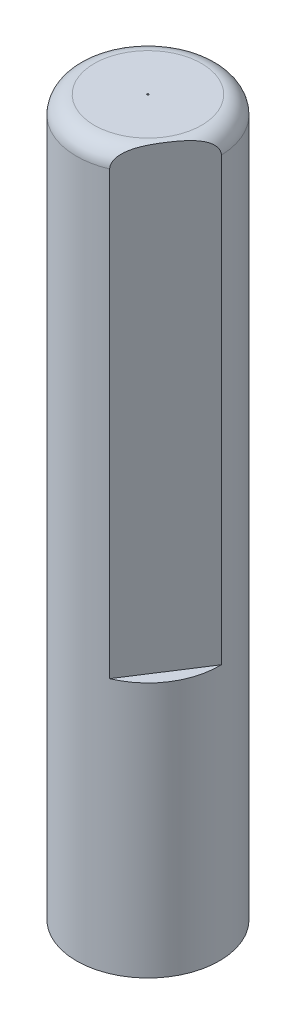
ISO-10303-21;
HEADER;
FILE_DESCRIPTION(('STEP AP214'),'2;1');
FILE_NAME('part.step','',(''),(''),'','','');
FILE_SCHEMA(('AUTOMOTIVE_DESIGN { 1 0 10303 214 1 1 1 1 }'));
ENDSEC;
DATA;
#1=APPLICATION_CONTEXT('core data for automotive mechanical design processes');
#2=APPLICATION_PROTOCOL_DEFINITION('international standard','automotive_design',2000,#1);
#3=PRODUCT_CONTEXT('',#1,'mechanical');
#4=PRODUCT('Part','Part','',(#3));
#5=PRODUCT_RELATED_PRODUCT_CATEGORY('part','',(#4));
#6=PRODUCT_DEFINITION_FORMATION('','',#4);
#7=PRODUCT_DEFINITION_CONTEXT('part definition',#1,'design');
#8=PRODUCT_DEFINITION('design','',#6,#7);
#9=PRODUCT_DEFINITION_SHAPE('','',#8);
#10=(LENGTH_UNIT() NAMED_UNIT(*) SI_UNIT(.MILLI.,.METRE.));
#11=(NAMED_UNIT(*) PLANE_ANGLE_UNIT() SI_UNIT($,.RADIAN.));
#12=(NAMED_UNIT(*) SI_UNIT($,.STERADIAN.) SOLID_ANGLE_UNIT());
#13=UNCERTAINTY_MEASURE_WITH_UNIT(LENGTH_MEASURE(1.E-05),#10,'distance_accuracy_value','');
#14=(GEOMETRIC_REPRESENTATION_CONTEXT(3) GLOBAL_UNCERTAINTY_ASSIGNED_CONTEXT((#13)) GLOBAL_UNIT_ASSIGNED_CONTEXT((#10,
#11,#12)) REPRESENTATION_CONTEXT('',''));
#15=CARTESIAN_POINT('',(0.,0.,0.));
#16=DIRECTION('',(0.,0.,1.));
#17=DIRECTION('',(1.,0.,0.));
#18=AXIS2_PLACEMENT_3D('',#15,#16,#17);
#19=CARTESIAN_POINT('',(0.,40.,0.));
#20=DIRECTION('',(0.,-1.,0.));
#21=DIRECTION('',(0.,0.,-1.));
#22=AXIS2_PLACEMENT_3D('',#19,#20,#21);
#23=CYLINDRICAL_SURFACE('',#22,4.);
#24=CARTESIAN_POINT('',(0.,39.,0.));
#25=DIRECTION('',(0.,1.,0.));
#26=DIRECTION('',(0.,0.,1.));
#27=AXIS2_PLACEMENT_3D('',#24,#25,#26);
#28=CIRCLE('',#27,4.);
#29=CARTESIAN_POINT('',(1.54618885179598,39.,3.68907848040426));
#30=VERTEX_POINT('',#29);
#31=CARTESIAN_POINT('',(3.99851204729971,39.,-0.109093572675266));
#32=VERTEX_POINT('',#31);
#33=EDGE_CURVE('E46',#30,#32,#28,.F.);
#34=ORIENTED_EDGE('',*,*,#33,.T.);
#35=DIRECTION('',(0.,1.,0.));
#36=VECTOR('',#35,1.);
#37=CARTESIAN_POINT('',(3.99851204729971,14.3,-0.109093572675266));
#38=LINE('',#37,#36);
#39=CARTESIAN_POINT('',(3.99851204729971,14.3,-0.109093572675266));
#40=VERTEX_POINT('',#39);
#41=EDGE_CURVE('E52',#40,#32,#38,.T.);
#42=ORIENTED_EDGE('',*,*,#41,.F.);
#43=CARTESIAN_POINT('',(0.,14.3,0.));
#44=DIRECTION('',(0.,1.,0.));
#45=DIRECTION('',(0.,0.,1.));
#46=AXIS2_PLACEMENT_3D('',#43,#44,#45);
#47=CIRCLE('',#46,4.);
#48=CARTESIAN_POINT('',(1.54618885179598,14.3,3.68907848040426));
#49=VERTEX_POINT('',#48);
#50=EDGE_CURVE('E64',#49,#40,#47,.T.);
#51=ORIENTED_EDGE('',*,*,#50,.F.);
#52=DIRECTION('',(0.,1.,0.));
#53=VECTOR('',#52,1.);
#54=CARTESIAN_POINT('',(1.54618885179598,14.3,3.68907848040426));
#55=LINE('',#54,#53);
#56=EDGE_CURVE('E71',#49,#30,#55,.T.);
#57=ORIENTED_EDGE('',*,*,#56,.T.);
#58=EDGE_LOOP('',(#34,#42,#51,#57));
#59=FACE_BOUND('',#58,.T.);
#60=CARTESIAN_POINT('',(0.,0.,0.));
#61=DIRECTION('',(0.,1.,0.));
#62=DIRECTION('',(0.,0.,1.));
#63=AXIS2_PLACEMENT_3D('',#60,#61,#62);
#64=CIRCLE('',#63,4.);
#65=CARTESIAN_POINT('',(0.,0.,4.));
#66=VERTEX_POINT('',#65);
#67=EDGE_CURVE('E77',#66,#66,#64,.T.);
#68=ORIENTED_EDGE('',*,*,#67,.T.);
#69=EDGE_LOOP('',(#68));
#70=FACE_BOUND('',#69,.T.);
#71=ADVANCED_FACE('F33',(#59,#70),#23,.T.);
#72=CARTESIAN_POINT('',(0.,40.,0.));
#73=DIRECTION('',(0.,1.,0.));
#74=DIRECTION('',(0.,0.,1.));
#75=AXIS2_PLACEMENT_3D('',#72,#73,#74);
#76=PLANE('',#75);
#77=CARTESIAN_POINT('',(0.,40.,0.));
#78=DIRECTION('',(0.,1.,0.));
#79=DIRECTION('',(0.,0.,1.));
#80=AXIS2_PLACEMENT_3D('',#77,#78,#79);
#81=CIRCLE('',#80,0.05);
#82=CARTESIAN_POINT('',(0.,40.,0.05));
#83=VERTEX_POINT('',#82);
#84=EDGE_CURVE('E118',#83,#83,#81,.T.);
#85=ORIENTED_EDGE('',*,*,#84,.F.);
#86=EDGE_LOOP('',(#85));
#87=FACE_BOUND('',#86,.T.);
#88=CARTESIAN_POINT('',(0.,40.,0.));
#89=DIRECTION('',(0.,1.,0.));
#90=DIRECTION('',(0.,0.,1.));
#91=AXIS2_PLACEMENT_3D('',#88,#89,#90);
#92=CIRCLE('',#91,3.);
#93=CARTESIAN_POINT('',(0.,40.,3.));
#94=VERTEX_POINT('',#93);
#95=EDGE_CURVE('E82',#94,#94,#92,.T.);
#96=ORIENTED_EDGE('',*,*,#95,.T.);
#97=EDGE_LOOP('',(#96));
#98=FACE_BOUND('',#97,.T.);
#99=ADVANCED_FACE('F86',(#87,#98),#76,.T.);
#100=CARTESIAN_POINT('',(0.,0.,0.));
#101=DIRECTION('',(0.,1.,0.));
#102=DIRECTION('',(0.,0.,1.));
#103=AXIS2_PLACEMENT_3D('',#100,#101,#102);
#104=PLANE('',#103);
#105=ORIENTED_EDGE('',*,*,#67,.F.);
#106=EDGE_LOOP('',(#105));
#107=FACE_BOUND('',#106,.T.);
#108=ADVANCED_FACE('F89',(#107),#104,.F.);
#109=CARTESIAN_POINT('',(0.,39.,0.));
#110=DIRECTION('',(0.,1.,0.));
#111=DIRECTION('',(0.,0.,1.));
#112=AXIS2_PLACEMENT_3D('',#109,#110,#111);
#113=TOROIDAL_SURFACE('',#112,3.,1.);
#114=CARTESIAN_POINT('',(3.99851202810345,38.9998,-0.109093542943977));
#115=CARTESIAN_POINT('',(3.99851824517361,39.0189950744715,-0.109103171977453));
#116=CARTESIAN_POINT('',(3.99798841695442,39.0381768500488,-0.108282571031078));
#117=CARTESIAN_POINT('',(3.99588573081514,39.0763256928036,-0.105025918830723));
#118=CARTESIAN_POINT('',(3.99431394904272,39.0952929609931,-0.102591534320352));
#119=CARTESIAN_POINT('',(3.98812749551361,39.151199113523,-0.0930099200596374));
#120=CARTESIAN_POINT('',(3.98204020341005,39.1876115277384,-0.0835818875763722));
#121=CARTESIAN_POINT('',(3.96647755197017,39.2576525985254,-0.0594783648926014));
#122=CARTESIAN_POINT('',(3.95701458842517,39.2912908927355,-0.0448220733638847));
#123=CARTESIAN_POINT('',(3.93532294282226,39.3554744810642,-0.0112259298109686));
#124=CARTESIAN_POINT('',(3.92308596540246,39.3860100919903,0.00772677011670177));
#125=CARTESIAN_POINT('',(3.89053953228075,39.4565909108332,0.0581348700510551));
#126=CARTESIAN_POINT('',(3.86906452066948,39.4947993961929,0.0913954896508889));
#127=CARTESIAN_POINT('',(3.82316362758298,39.5645260277001,0.16248705280708));
#128=CARTESIAN_POINT('',(3.79873354887953,39.5960344781688,0.200324497054268));
#129=CARTESIAN_POINT('',(3.75220814044664,39.6483760346623,0.272383313115669));
#130=CARTESIAN_POINT('',(3.7304054311356,39.6701132137222,0.306151472768706));
#131=CARTESIAN_POINT('',(3.68585054508425,39.7100268542703,0.375158332606205));
#132=CARTESIAN_POINT('',(3.66309766198652,39.7282006074288,0.410398126801047));
#133=CARTESIAN_POINT('',(3.61687454725704,39.7615000699751,0.481988748662682));
#134=CARTESIAN_POINT('',(3.59340236367546,39.7766164462198,0.518342599520414));
#135=CARTESIAN_POINT('',(3.54601671667992,39.804166558947,0.591733757939312));
#136=CARTESIAN_POINT('',(3.52210345055714,39.8166014646796,0.628770759934778));
#137=CARTESIAN_POINT('',(3.4601192765708,39.8456908357651,0.724772199630726));
#138=CARTESIAN_POINT('',(3.42181642294887,39.8606584632945,0.784095876235326));
#139=CARTESIAN_POINT('',(3.34477672047379,39.8862333715987,0.903415403716402));
#140=CARTESIAN_POINT('',(3.30603959312196,39.8968376678736,0.963411685933223));
#141=CARTESIAN_POINT('',(3.22824194489927,39.9147178032767,1.08390512408057));
#142=CARTESIAN_POINT('',(3.1891808386309,39.9219847350082,1.14440318667807));
#143=CARTESIAN_POINT('',(3.11095700013189,39.9339421960324,1.26555671073896));
#144=CARTESIAN_POINT('',(3.07179429432871,39.9386333386944,1.32621213127136));
#145=CARTESIAN_POINT('',(2.99330109638701,39.9460285492576,1.44778284076251));
#146=CARTESIAN_POINT('',(2.9539704485416,39.9487267646091,1.50869837088099));
#147=CARTESIAN_POINT('',(2.87528456554741,39.9524800924675,1.63056751207265));
#148=CARTESIAN_POINT('',(2.83592932894269,39.9535350961358,1.69152112540079));
#149=CARTESIAN_POINT('',(2.7572727298212,39.9541527270616,1.81334491156458));
#150=CARTESIAN_POINT('',(2.71797137203506,39.9537175186063,1.87421507707338));
#151=CARTESIAN_POINT('',(2.63938502755026,39.9512972390789,1.99593005245799));
#152=CARTESIAN_POINT('',(2.60010003981029,39.9493122894254,2.05677486394659));
#153=CARTESIAN_POINT('',(2.5322630147351,39.9443030555334,2.16184123255454));
#154=CARTESIAN_POINT('',(2.50370195572398,39.9417090970132,2.20607676249663));
#155=CARTESIAN_POINT('',(2.44661490623173,39.9353679534134,2.29449350804297));
#156=CARTESIAN_POINT('',(2.41808892149857,39.9316205995091,2.33867471474472));
#157=CARTESIAN_POINT('',(2.33258246275743,39.9183136517893,2.47110760227924));
#158=CARTESIAN_POINT('',(2.275680725093,39.9066895981002,2.55923733581719));
#159=CARTESIAN_POINT('',(2.18629845619215,39.8818825742666,2.69767310007635));
#160=CARTESIAN_POINT('',(2.15359892221944,39.871405043988,2.74831832347579));
#161=CARTESIAN_POINT('',(2.08858469984483,39.8470043549461,2.84901271927512));
#162=CARTESIAN_POINT('',(2.05626985445817,39.8330826560031,2.89906213481391));
#163=CARTESIAN_POINT('',(1.99236286718969,39.8010203584254,2.99804163861043));
#164=CARTESIAN_POINT('',(1.96076871673026,39.7828936276516,3.04697483776453));
#165=CARTESIAN_POINT('',(1.8986165336737,39.741438403647,3.14323649085989));
#166=CARTESIAN_POINT('',(1.86805726479277,39.718116388894,3.19056685956453));
#167=CARTESIAN_POINT('',(1.81463637490991,39.6705364494529,3.27330543634581));
#168=CARTESIAN_POINT('',(1.7914744631834,39.6474362342943,3.3091787363973));
#169=CARTESIAN_POINT('',(1.74665463146518,39.5965795813335,3.37859594558408));
#170=CARTESIAN_POINT('',(1.72499783252854,39.5688197243455,3.41213811842292));
#171=CARTESIAN_POINT('',(1.68370980135965,39.5077907879947,3.47608525491777));
#172=CARTESIAN_POINT('',(1.66410058003659,39.4744702213778,3.50645612795296));
#173=CARTESIAN_POINT('',(1.62820545479316,39.4021816708344,3.56205070120959));
#174=CARTESIAN_POINT('',(1.61191304740526,39.363224999736,3.58728447403839));
#175=CARTESIAN_POINT('',(1.58796298252,39.291922427329,3.62437847016558));
#176=CARTESIAN_POINT('',(1.5791685974072,39.2608759252444,3.63799926363223));
#177=CARTESIAN_POINT('',(1.56446178170275,39.1965672900915,3.66077726308225));
#178=CARTESIAN_POINT('',(1.5585430376257,39.1633101947078,3.66994424742753));
#179=CARTESIAN_POINT('',(1.55160455952667,39.1081610032244,3.68069060160099));
#180=CARTESIAN_POINT('',(1.54957992444179,39.0866866449046,3.68382636788626));
#181=CARTESIAN_POINT('',(1.54686587130394,39.0434139755145,3.68802990875627));
#182=CARTESIAN_POINT('',(1.54617893041032,39.0216151386135,3.68909384670256));
#183=CARTESIAN_POINT('',(1.54618887099225,38.9998,3.68907845067297));
#184=B_SPLINE_CURVE_WITH_KNOTS('',3,(#114,#115,#116,#117,#118,#119,#120,#121,#122,#123,#124,
#125,#126,#127,#128,#129,#130,#131,#132,#133,#134,#135,#136,#137,#138,#139,#140,#141,#142,#143,
#144,#145,#146,#147,#148,#149,#150,#151,#152,#153,#154,#155,#156,#157,#158,#159,#160,#161,#162,
#163,#164,#165,#166,#167,#168,#169,#170,#171,#172,#173,#174,#175,#176,#177,#178,#179,#180,#181,
#182,#183),.UNSPECIFIED.,.F.,.F.,(4,2,2,2,2,2,2,2,2,2,2,2,2,2,2,2,2,2,2,2,2,2,2,2,2,2,2,2,2,2,2,
2,2,2,4),(0.,0.0575344747451716,0.115009619276603,0.228577497167076,0.341732564617331,
0.455230580215976,0.619374189281705,0.783753739382317,0.920648265927462,1.05764643725385,
1.1950567073338,1.33240693821998,1.54875798876412,1.76525677748926,1.98233008862061,
2.19935168592779,2.41700809515458,2.63467892029673,2.85203374863387,3.06937154943429,
3.22751429971477,3.38568020865258,3.70205206404476,3.8855418201803,4.06895393652833,
4.25176956389871,4.43435848522626,4.57976544694209,4.72527957664519,4.87222452076401,
5.01887850596692,5.12355597529953,5.22800257432773,5.29325991352605,5.35863798261898),.UNSPECIFIED.);
#185=EDGE_CURVE('E12',#32,#30,#184,.T.);
#186=ORIENTED_EDGE('',*,*,#185,.F.);
#187=ORIENTED_EDGE('',*,*,#33,.F.);
#188=EDGE_LOOP('',(#186,#187));
#189=FACE_BOUND('',#188,.T.);
#190=ORIENTED_EDGE('',*,*,#95,.F.);
#191=EDGE_LOOP('',(#190));
#192=FACE_BOUND('',#191,.T.);
#193=ADVANCED_FACE('F35',(#189,#192),#113,.T.);
#194=CARTESIAN_POINT('',(1.54618885179598,14.3,3.68907848040426));
#195=DIRECTION('',(-0.840106196832681,0.,-0.542421955716515));
#196=DIRECTION('',(-0.542421955716515,0.,0.840106196832681));
#197=AXIS2_PLACEMENT_3D('',#194,#195,#196);
#198=PLANE('',#197);
#199=ORIENTED_EDGE('',*,*,#185,.T.);
#200=ORIENTED_EDGE('',*,*,#56,.F.);
#201=DIRECTION('',(-0.542421955716514,0.,0.840106196832681));
#202=VECTOR('',#201,1.);
#203=CARTESIAN_POINT('',(1.54618885179598,14.3,3.68907848040426));
#204=LINE('',#203,#202);
#205=EDGE_CURVE('E66',#40,#49,#204,.T.);
#206=ORIENTED_EDGE('',*,*,#205,.F.);
#207=ORIENTED_EDGE('',*,*,#41,.T.);
#208=EDGE_LOOP('',(#199,#200,#206,#207));
#209=FACE_BOUND('',#208,.T.);
#210=ADVANCED_FACE('F70',(#209),#198,.F.);
#211=CARTESIAN_POINT('',(0.,14.3,0.));
#212=DIRECTION('',(0.,1.,0.));
#213=DIRECTION('',(0.,0.,1.));
#214=AXIS2_PLACEMENT_3D('',#211,#212,#213);
#215=PLANE('',#214);
#216=ORIENTED_EDGE('',*,*,#50,.T.);
#217=ORIENTED_EDGE('',*,*,#205,.T.);
#218=EDGE_LOOP('',(#216,#217));
#219=FACE_BOUND('',#218,.T.);
#220=ADVANCED_FACE('F65',(#219),#215,.T.);
#221=CARTESIAN_POINT('',(0.,39.9,0.));
#222=DIRECTION('',(0.,1.,0.));
#223=DIRECTION('',(0.,0.,1.));
#224=AXIS2_PLACEMENT_3D('',#221,#222,#223);
#225=CYLINDRICAL_SURFACE('',#224,0.05);
#226=CARTESIAN_POINT('',(0.,39.9,0.));
#227=DIRECTION('',(0.,1.,0.));
#228=DIRECTION('',(0.,0.,1.));
#229=AXIS2_PLACEMENT_3D('',#226,#227,#228);
#230=CIRCLE('',#229,0.05);
#231=CARTESIAN_POINT('',(0.,39.9,0.05));
#232=VERTEX_POINT('',#231);
#233=EDGE_CURVE('E68',#232,#232,#230,.T.);
#234=ORIENTED_EDGE('',*,*,#233,.F.);
#235=EDGE_LOOP('',(#234));
#236=FACE_BOUND('',#235,.T.);
#237=ORIENTED_EDGE('',*,*,#84,.T.);
#238=EDGE_LOOP('',(#237));
#239=FACE_BOUND('',#238,.T.);
#240=ADVANCED_FACE('F107',(#236,#239),#225,.F.);
#241=CARTESIAN_POINT('',(0.,39.9,0.));
#242=DIRECTION('',(0.,1.,0.));
#243=DIRECTION('',(0.,0.,1.));
#244=AXIS2_PLACEMENT_3D('',#241,#242,#243);
#245=PLANE('',#244);
#246=ORIENTED_EDGE('',*,*,#233,.T.);
#247=EDGE_LOOP('',(#246));
#248=FACE_BOUND('',#247,.T.);
#249=ADVANCED_FACE('F110',(#248),#245,.T.);
#250=CLOSED_SHELL('',(#71,#99,#108,#193,#210,#220,#240,#249));
#251=MANIFOLD_SOLID_BREP('B2',#250);
#252=ADVANCED_BREP_SHAPE_REPRESENTATION('',(#18,#251),#14);
#253=SHAPE_DEFINITION_REPRESENTATION(#9,#252);
ENDSEC;
END-ISO-10303-21;
